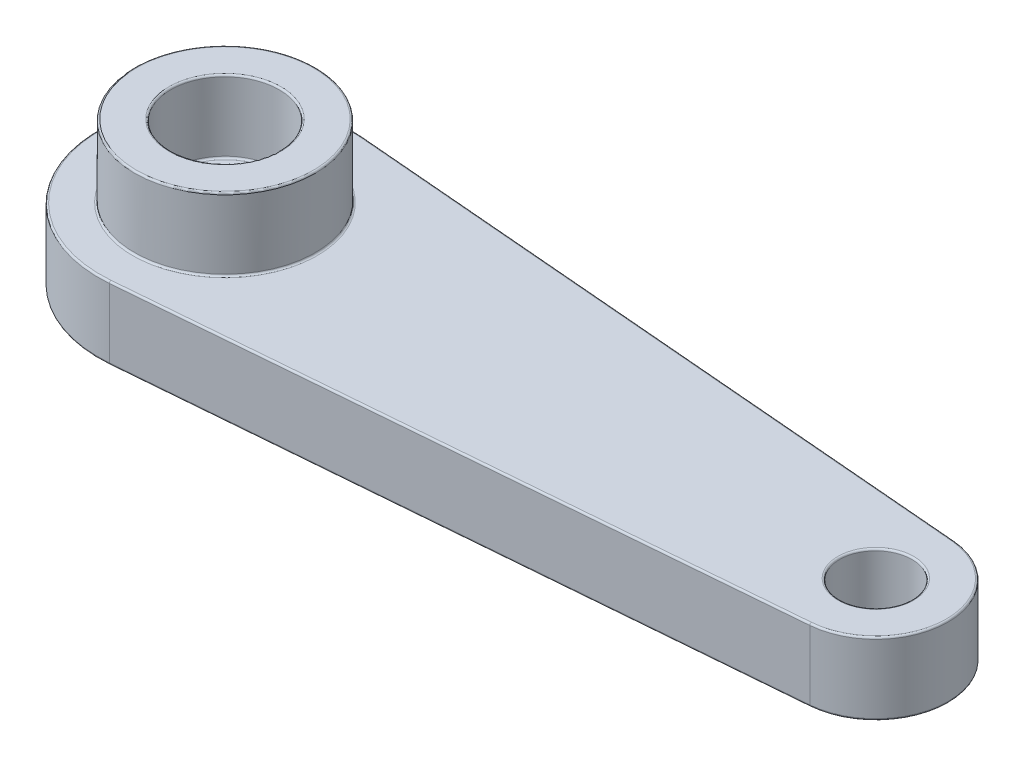
ISO-10303-21;
HEADER;
FILE_DESCRIPTION(('STEP AP214'),'2;1');
FILE_NAME('part.step','',(''),(''),'','','');
FILE_SCHEMA(('AUTOMOTIVE_DESIGN { 1 0 10303 214 1 1 1 1 }'));
ENDSEC;
DATA;
#1=APPLICATION_CONTEXT('core data for automotive mechanical design processes');
#2=APPLICATION_PROTOCOL_DEFINITION('international standard','automotive_design',2000,#1);
#3=PRODUCT_CONTEXT('',#1,'mechanical');
#4=PRODUCT('Part','Part','',(#3));
#5=PRODUCT_RELATED_PRODUCT_CATEGORY('part','',(#4));
#6=PRODUCT_DEFINITION_FORMATION('','',#4);
#7=PRODUCT_DEFINITION_CONTEXT('part definition',#1,'design');
#8=PRODUCT_DEFINITION('design','',#6,#7);
#9=PRODUCT_DEFINITION_SHAPE('','',#8);
#10=(LENGTH_UNIT() NAMED_UNIT(*) SI_UNIT(.MILLI.,.METRE.));
#11=(NAMED_UNIT(*) PLANE_ANGLE_UNIT() SI_UNIT($,.RADIAN.));
#12=(NAMED_UNIT(*) SI_UNIT($,.STERADIAN.) SOLID_ANGLE_UNIT());
#13=UNCERTAINTY_MEASURE_WITH_UNIT(LENGTH_MEASURE(1.E-05),#10,'distance_accuracy_value','');
#14=(GEOMETRIC_REPRESENTATION_CONTEXT(3) GLOBAL_UNCERTAINTY_ASSIGNED_CONTEXT((#13)) GLOBAL_UNIT_ASSIGNED_CONTEXT((#10,
#11,#12)) REPRESENTATION_CONTEXT('',''));
#15=CARTESIAN_POINT('',(0.,0.,0.));
#16=DIRECTION('',(0.,0.,1.));
#17=DIRECTION('',(1.,0.,0.));
#18=AXIS2_PLACEMENT_3D('',#15,#16,#17);
#19=CARTESIAN_POINT('',(0.,-2.,0.));
#20=DIRECTION('',(0.,1.,0.));
#21=DIRECTION('',(0.,0.,1.));
#22=AXIS2_PLACEMENT_3D('',#19,#20,#21);
#23=CYLINDRICAL_SURFACE('',#22,0.5);
#24=CARTESIAN_POINT('',(0.,-1.45,0.));
#25=DIRECTION('',(0.,-1.,0.));
#26=DIRECTION('',(0.,0.,-1.));
#27=AXIS2_PLACEMENT_3D('',#24,#25,#26);
#28=CIRCLE('',#27,0.5);
#29=CARTESIAN_POINT('',(0.,-1.45,-0.5));
#30=VERTEX_POINT('',#29);
#31=EDGE_CURVE('E223',#30,#30,#28,.T.);
#32=ORIENTED_EDGE('',*,*,#31,.T.);
#33=EDGE_LOOP('',(#32));
#34=FACE_BOUND('',#33,.T.);
#35=CARTESIAN_POINT('',(0.,-0.0499999999999999,0.));
#36=DIRECTION('',(0.,-1.,0.));
#37=DIRECTION('',(0.,0.,-1.));
#38=AXIS2_PLACEMENT_3D('',#35,#36,#37);
#39=CIRCLE('',#38,0.5);
#40=CARTESIAN_POINT('',(0.,-0.0499999999999999,-0.5));
#41=VERTEX_POINT('',#40);
#42=EDGE_CURVE('E220',#41,#41,#39,.F.);
#43=ORIENTED_EDGE('',*,*,#42,.T.);
#44=EDGE_LOOP('',(#43));
#45=FACE_BOUND('',#44,.T.);
#46=ADVANCED_FACE('F33',(#34,#45),#23,.F.);
#47=CARTESIAN_POINT('',(0.,2.,0.));
#48=DIRECTION('',(0.,1.,0.));
#49=DIRECTION('',(0.,0.,1.));
#50=AXIS2_PLACEMENT_3D('',#47,#48,#49);
#51=PLANE('',#50);
#52=CARTESIAN_POINT('',(0.,2.,0.));
#53=DIRECTION('',(0.,1.,0.));
#54=DIRECTION('',(0.,0.,1.));
#55=AXIS2_PLACEMENT_3D('',#52,#53,#54);
#56=CIRCLE('',#55,1.55);
#57=CARTESIAN_POINT('',(0.,2.,1.55));
#58=VERTEX_POINT('',#57);
#59=EDGE_CURVE('E11',#58,#58,#56,.F.);
#60=ORIENTED_EDGE('',*,*,#59,.T.);
#61=EDGE_LOOP('',(#60));
#62=FACE_BOUND('',#61,.T.);
#63=CARTESIAN_POINT('',(0.,2.,0.));
#64=DIRECTION('',(0.,1.,0.));
#65=DIRECTION('',(0.,0.,1.));
#66=AXIS2_PLACEMENT_3D('',#63,#64,#65);
#67=CIRCLE('',#66,2.45);
#68=CARTESIAN_POINT('',(0.,2.,2.45));
#69=VERTEX_POINT('',#68);
#70=EDGE_CURVE('E42',#69,#69,#67,.T.);
#71=ORIENTED_EDGE('',*,*,#70,.T.);
#72=EDGE_LOOP('',(#71));
#73=FACE_BOUND('',#72,.T.);
#74=ADVANCED_FACE('F266',(#62,#73),#51,.T.);
#75=CARTESIAN_POINT('',(0.,2.,0.));
#76=DIRECTION('',(0.,-1.,0.));
#77=DIRECTION('',(0.,0.,-1.));
#78=AXIS2_PLACEMENT_3D('',#75,#76,#77);
#79=CYLINDRICAL_SURFACE('',#78,2.5);
#80=CARTESIAN_POINT('',(0.,0.0499999999999999,0.));
#81=DIRECTION('',(0.,-1.,0.));
#82=DIRECTION('',(0.,0.,-1.));
#83=AXIS2_PLACEMENT_3D('',#80,#81,#82);
#84=CIRCLE('',#83,2.5);
#85=CARTESIAN_POINT('',(0.,0.0499999999999999,-2.5));
#86=VERTEX_POINT('',#85);
#87=EDGE_CURVE('E182',#86,#86,#84,.F.);
#88=ORIENTED_EDGE('',*,*,#87,.T.);
#89=EDGE_LOOP('',(#88));
#90=FACE_BOUND('',#89,.T.);
#91=CARTESIAN_POINT('',(0.,1.95,0.));
#92=DIRECTION('',(0.,1.,0.));
#93=DIRECTION('',(0.,0.,1.));
#94=AXIS2_PLACEMENT_3D('',#91,#92,#93);
#95=CIRCLE('',#94,2.5);
#96=CARTESIAN_POINT('',(0.,1.95,2.5));
#97=VERTEX_POINT('',#96);
#98=EDGE_CURVE('E179',#97,#97,#95,.F.);
#99=ORIENTED_EDGE('',*,*,#98,.T.);
#100=EDGE_LOOP('',(#99));
#101=FACE_BOUND('',#100,.T.);
#102=ADVANCED_FACE('F272',(#90,#101),#79,.T.);
#103=CARTESIAN_POINT('',(0.,2.,0.));
#104=DIRECTION('',(0.,-1.,0.));
#105=DIRECTION('',(0.,0.,-1.));
#106=AXIS2_PLACEMENT_3D('',#103,#104,#105);
#107=CYLINDRICAL_SURFACE('',#106,1.5);
#108=CARTESIAN_POINT('',(0.,0.0499999999999999,0.));
#109=DIRECTION('',(0.,-1.,0.));
#110=DIRECTION('',(0.,0.,-1.));
#111=AXIS2_PLACEMENT_3D('',#108,#109,#110);
#112=CIRCLE('',#111,1.5);
#113=CARTESIAN_POINT('',(0.,0.0499999999999999,-1.5));
#114=VERTEX_POINT('',#113);
#115=EDGE_CURVE('E188',#114,#114,#112,.T.);
#116=ORIENTED_EDGE('',*,*,#115,.T.);
#117=EDGE_LOOP('',(#116));
#118=FACE_BOUND('',#117,.T.);
#119=CARTESIAN_POINT('',(0.,1.95,0.));
#120=DIRECTION('',(0.,1.,0.));
#121=DIRECTION('',(0.,0.,1.));
#122=AXIS2_PLACEMENT_3D('',#119,#120,#121);
#123=CIRCLE('',#122,1.5);
#124=CARTESIAN_POINT('',(0.,1.95,1.5));
#125=VERTEX_POINT('',#124);
#126=EDGE_CURVE('E185',#125,#125,#123,.T.);
#127=ORIENTED_EDGE('',*,*,#126,.T.);
#128=EDGE_LOOP('',(#127));
#129=FACE_BOUND('',#128,.T.);
#130=ADVANCED_FACE('F302',(#118,#129),#107,.F.);
#131=CARTESIAN_POINT('',(0.,0.,0.));
#132=DIRECTION('',(0.,-1.,0.));
#133=DIRECTION('',(0.,0.,-1.));
#134=AXIS2_PLACEMENT_3D('',#131,#132,#133);
#135=PLANE('',#134);
#136=CARTESIAN_POINT('',(0.,0.,0.));
#137=DIRECTION('',(0.,-1.,0.));
#138=DIRECTION('',(0.,0.,-1.));
#139=AXIS2_PLACEMENT_3D('',#136,#137,#138);
#140=CIRCLE('',#139,0.55);
#141=CARTESIAN_POINT('',(0.,0.,-0.55));
#142=VERTEX_POINT('',#141);
#143=EDGE_CURVE('E141',#142,#142,#140,.T.);
#144=ORIENTED_EDGE('',*,*,#143,.T.);
#145=EDGE_LOOP('',(#144));
#146=FACE_BOUND('',#145,.T.);
#147=CARTESIAN_POINT('',(0.,0.,0.));
#148=DIRECTION('',(0.,-1.,0.));
#149=DIRECTION('',(0.,0.,-1.));
#150=AXIS2_PLACEMENT_3D('',#147,#148,#149);
#151=CIRCLE('',#150,1.45);
#152=CARTESIAN_POINT('',(0.,0.,-1.45));
#153=VERTEX_POINT('',#152);
#154=EDGE_CURVE('E138',#153,#153,#151,.F.);
#155=ORIENTED_EDGE('',*,*,#154,.T.);
#156=EDGE_LOOP('',(#155));
#157=FACE_BOUND('',#156,.T.);
#158=ADVANCED_FACE('F291',(#146,#157),#135,.F.);
#159=CARTESIAN_POINT('',(0.,-2.,0.));
#160=DIRECTION('',(0.,1.,0.));
#161=DIRECTION('',(0.,0.,1.));
#162=AXIS2_PLACEMENT_3D('',#159,#160,#161);
#163=CYLINDRICAL_SURFACE('',#162,3.5);
#164=DIRECTION('',(0.,1.,0.));
#165=VECTOR('',#164,1.);
#166=CARTESIAN_POINT('',(0.291666666666667,-2.,3.48782605007124));
#167=LINE('',#166,#165);
#168=CARTESIAN_POINT('',(0.291666666666667,-1.95,3.48782605007124));
#169=VERTEX_POINT('',#168);
#170=CARTESIAN_POINT('',(0.291666666666667,-0.0499999999999999,3.48782605007124));
#171=VERTEX_POINT('',#170);
#172=EDGE_CURVE('E203',#169,#171,#167,.T.);
#173=ORIENTED_EDGE('',*,*,#172,.T.);
#174=CARTESIAN_POINT('',(0.,-0.0499999999999999,0.));
#175=DIRECTION('',(0.,-1.,0.));
#176=DIRECTION('',(0.,0.,-1.));
#177=AXIS2_PLACEMENT_3D('',#174,#175,#176);
#178=CIRCLE('',#177,3.5);
#179=CARTESIAN_POINT('',(0.291666666666667,-0.0499999999999999,-3.48782605007124));
#180=VERTEX_POINT('',#179);
#181=EDGE_CURVE('E166',#171,#180,#178,.T.);
#182=ORIENTED_EDGE('',*,*,#181,.T.);
#183=DIRECTION('',(0.,1.,0.));
#184=VECTOR('',#183,1.);
#185=CARTESIAN_POINT('',(0.291666666666667,-2.,-3.48782605007124));
#186=LINE('',#185,#184);
#187=CARTESIAN_POINT('',(0.291666666666667,-1.95,-3.48782605007124));
#188=VERTEX_POINT('',#187);
#189=EDGE_CURVE('E213',#188,#180,#186,.T.);
#190=ORIENTED_EDGE('',*,*,#189,.F.);
#191=CARTESIAN_POINT('',(0.,-1.95,0.));
#192=DIRECTION('',(0.,-1.,0.));
#193=DIRECTION('',(0.,0.,-1.));
#194=AXIS2_PLACEMENT_3D('',#191,#192,#193);
#195=CIRCLE('',#194,3.5);
#196=EDGE_CURVE('E110',#188,#169,#195,.F.);
#197=ORIENTED_EDGE('',*,*,#196,.T.);
#198=EDGE_LOOP('',(#173,#182,#190,#197));
#199=FACE_BOUND('',#198,.T.);
#200=ADVANCED_FACE('F217',(#199),#163,.T.);
#201=CARTESIAN_POINT('',(0.291666666666667,-2.,-3.48782605007124));
#202=DIRECTION('',(0.0833333333333334,0.,-0.996521728591783));
#203=DIRECTION('',(-0.996521728591783,0.,-0.0833333333333334));
#204=AXIS2_PLACEMENT_3D('',#201,#202,#203);
#205=PLANE('',#204);
#206=ORIENTED_EDGE('',*,*,#189,.T.);
#207=DIRECTION('',(-0.996521728591783,0.,-0.0833333333333334));
#208=VECTOR('',#207,1.);
#209=CARTESIAN_POINT('',(18.1666666666667,-0.05,-1.99304345718356));
#210=LINE('',#209,#208);
#211=CARTESIAN_POINT('',(18.1666666666667,-0.0499999999999999,-1.99304345718357));
#212=VERTEX_POINT('',#211);
#213=EDGE_CURVE('E50',#180,#212,#210,.F.);
#214=ORIENTED_EDGE('',*,*,#213,.T.);
#215=DIRECTION('',(0.,1.,0.));
#216=VECTOR('',#215,1.);
#217=CARTESIAN_POINT('',(18.1666666666667,-2.,-1.99304345718357));
#218=LINE('',#217,#216);
#219=CARTESIAN_POINT('',(18.1666666666667,-1.95,-1.99304345718357));
#220=VERTEX_POINT('',#219);
#221=EDGE_CURVE('E214',#220,#212,#218,.T.);
#222=ORIENTED_EDGE('',*,*,#221,.F.);
#223=DIRECTION('',(-0.996521728591783,0.,-0.0833333333333334));
#224=VECTOR('',#223,1.);
#225=CARTESIAN_POINT('',(0.291666666666667,-1.95,-3.48782605007124));
#226=LINE('',#225,#224);
#227=EDGE_CURVE('E176',#220,#188,#226,.T.);
#228=ORIENTED_EDGE('',*,*,#227,.T.);
#229=EDGE_LOOP('',(#206,#214,#222,#228));
#230=FACE_BOUND('',#229,.T.);
#231=ADVANCED_FACE('F212',(#230),#205,.T.);
#232=CARTESIAN_POINT('',(18.,-2.,0.));
#233=DIRECTION('',(0.,1.,0.));
#234=DIRECTION('',(0.,0.,1.));
#235=AXIS2_PLACEMENT_3D('',#232,#233,#234);
#236=CYLINDRICAL_SURFACE('',#235,2.);
#237=ORIENTED_EDGE('',*,*,#221,.T.);
#238=CARTESIAN_POINT('',(18.,-0.0499999999999999,0.));
#239=DIRECTION('',(0.,-1.,0.));
#240=DIRECTION('',(0.,0.,-1.));
#241=AXIS2_PLACEMENT_3D('',#238,#239,#240);
#242=CIRCLE('',#241,2.);
#243=CARTESIAN_POINT('',(18.1666666666667,-0.0499999999999999,1.99304345718357));
#244=VERTEX_POINT('',#243);
#245=EDGE_CURVE('E174',#212,#244,#242,.T.);
#246=ORIENTED_EDGE('',*,*,#245,.T.);
#247=DIRECTION('',(0.,1.,0.));
#248=VECTOR('',#247,1.);
#249=CARTESIAN_POINT('',(18.1666666666667,-2.,1.99304345718357));
#250=LINE('',#249,#248);
#251=CARTESIAN_POINT('',(18.1666666666667,-1.95,1.99304345718357));
#252=VERTEX_POINT('',#251);
#253=EDGE_CURVE('E225',#252,#244,#250,.T.);
#254=ORIENTED_EDGE('',*,*,#253,.F.);
#255=CARTESIAN_POINT('',(18.,-1.95,0.));
#256=DIRECTION('',(0.,-1.,0.));
#257=DIRECTION('',(0.,0.,-1.));
#258=AXIS2_PLACEMENT_3D('',#255,#256,#257);
#259=CIRCLE('',#258,2.);
#260=EDGE_CURVE('E57',#252,#220,#259,.F.);
#261=ORIENTED_EDGE('',*,*,#260,.T.);
#262=EDGE_LOOP('',(#237,#246,#254,#261));
#263=FACE_BOUND('',#262,.T.);
#264=ADVANCED_FACE('F294',(#263),#236,.T.);
#265=CARTESIAN_POINT('',(0.291666666666667,-2.,3.48782605007124));
#266=DIRECTION('',(0.0833333333333334,0.,0.996521728591783));
#267=DIRECTION('',(0.996521728591783,0.,-0.0833333333333334));
#268=AXIS2_PLACEMENT_3D('',#265,#266,#267);
#269=PLANE('',#268);
#270=ORIENTED_EDGE('',*,*,#253,.T.);
#271=DIRECTION('',(0.996521728591783,0.,-0.0833333333333334));
#272=VECTOR('',#271,1.);
#273=CARTESIAN_POINT('',(0.291666666666667,-0.05,3.48782605007124));
#274=LINE('',#273,#272);
#275=EDGE_CURVE('E171',#244,#171,#274,.F.);
#276=ORIENTED_EDGE('',*,*,#275,.T.);
#277=ORIENTED_EDGE('',*,*,#172,.F.);
#278=DIRECTION('',(0.996521728591783,0.,-0.0833333333333334));
#279=VECTOR('',#278,1.);
#280=CARTESIAN_POINT('',(0.291666666666667,-1.95,3.48782605007124));
#281=LINE('',#280,#279);
#282=EDGE_CURVE('E169',#169,#252,#281,.T.);
#283=ORIENTED_EDGE('',*,*,#282,.T.);
#284=EDGE_LOOP('',(#270,#276,#277,#283));
#285=FACE_BOUND('',#284,.T.);
#286=ADVANCED_FACE('F286',(#285),#269,.T.);
#287=CARTESIAN_POINT('',(0.,-2.,0.));
#288=DIRECTION('',(0.,-1.,0.));
#289=DIRECTION('',(0.,0.,-1.));
#290=AXIS2_PLACEMENT_3D('',#287,#288,#289);
#291=PLANE('',#290);
#292=CARTESIAN_POINT('',(0.,-2.,0.));
#293=DIRECTION('',(0.,-1.,0.));
#294=DIRECTION('',(0.,0.,-1.));
#295=AXIS2_PLACEMENT_3D('',#292,#293,#294);
#296=CIRCLE('',#295,2.05);
#297=CARTESIAN_POINT('',(0.,-2.,-2.05));
#298=VERTEX_POINT('',#297);
#299=EDGE_CURVE('E131',#298,#298,#296,.F.);
#300=ORIENTED_EDGE('',*,*,#299,.T.);
#301=EDGE_LOOP('',(#300));
#302=FACE_BOUND('',#301,.T.);
#303=CARTESIAN_POINT('',(18.,-2.,0.));
#304=DIRECTION('',(0.,-1.,0.));
#305=DIRECTION('',(0.,0.,-1.));
#306=AXIS2_PLACEMENT_3D('',#303,#304,#305);
#307=CIRCLE('',#306,1.05);
#308=CARTESIAN_POINT('',(18.,-2.,-1.05));
#309=VERTEX_POINT('',#308);
#310=EDGE_CURVE('E128',#309,#309,#307,.F.);
#311=ORIENTED_EDGE('',*,*,#310,.T.);
#312=EDGE_LOOP('',(#311));
#313=FACE_BOUND('',#312,.T.);
#314=DIRECTION('',(0.996521728591783,0.,-0.0833333333333334));
#315=VECTOR('',#314,1.);
#316=CARTESIAN_POINT('',(0.2875,-2.,3.43799996364165));
#317=LINE('',#316,#315);
#318=CARTESIAN_POINT('',(18.1625,-2.,1.94321737075398));
#319=VERTEX_POINT('',#318);
#320=CARTESIAN_POINT('',(0.2875,-2.,3.43799996364165));
#321=VERTEX_POINT('',#320);
#322=EDGE_CURVE('E127',#319,#321,#317,.F.);
#323=ORIENTED_EDGE('',*,*,#322,.T.);
#324=CARTESIAN_POINT('',(0.,-2.,0.));
#325=DIRECTION('',(0.,-1.,0.));
#326=DIRECTION('',(0.,0.,-1.));
#327=AXIS2_PLACEMENT_3D('',#324,#325,#326);
#328=CIRCLE('',#327,3.45);
#329=CARTESIAN_POINT('',(0.2875,-2.,-3.43799996364165));
#330=VERTEX_POINT('',#329);
#331=EDGE_CURVE('E107',#321,#330,#328,.T.);
#332=ORIENTED_EDGE('',*,*,#331,.T.);
#333=DIRECTION('',(-0.996521728591783,0.,-0.0833333333333334));
#334=VECTOR('',#333,1.);
#335=CARTESIAN_POINT('',(0.2875,-2.,-3.43799996364165));
#336=LINE('',#335,#334);
#337=CARTESIAN_POINT('',(18.1625,-2.,-1.94321737075398));
#338=VERTEX_POINT('',#337);
#339=EDGE_CURVE('E117',#330,#338,#336,.F.);
#340=ORIENTED_EDGE('',*,*,#339,.T.);
#341=CARTESIAN_POINT('',(18.,-2.,0.));
#342=DIRECTION('',(0.,-1.,0.));
#343=DIRECTION('',(0.,0.,-1.));
#344=AXIS2_PLACEMENT_3D('',#341,#342,#343);
#345=CIRCLE('',#344,1.95);
#346=EDGE_CURVE('E122',#338,#319,#345,.T.);
#347=ORIENTED_EDGE('',*,*,#346,.T.);
#348=EDGE_LOOP('',(#323,#332,#340,#347));
#349=FACE_BOUND('',#348,.T.);
#350=ADVANCED_FACE('F125',(#302,#313,#349),#291,.T.);
#351=CARTESIAN_POINT('',(18.,0.,0.));
#352=DIRECTION('',(0.,-1.,0.));
#353=DIRECTION('',(0.,0.,-1.));
#354=AXIS2_PLACEMENT_3D('',#351,#352,#353);
#355=CIRCLE('',#354,1.05);
#356=CARTESIAN_POINT('',(18.,0.,-1.05));
#357=VERTEX_POINT('',#356);
#358=EDGE_CURVE('E162',#357,#357,#355,.T.);
#359=ORIENTED_EDGE('',*,*,#358,.T.);
#360=EDGE_LOOP('',(#359));
#361=FACE_BOUND('',#360,.T.);
#362=DIRECTION('',(-0.996521728591783,0.,-0.0833333333333334));
#363=VECTOR('',#362,1.);
#364=CARTESIAN_POINT('',(0.2875,0.,-3.43799996364165));
#365=LINE('',#364,#363);
#366=CARTESIAN_POINT('',(18.1625,0.,-1.94321737075398));
#367=VERTEX_POINT('',#366);
#368=CARTESIAN_POINT('',(0.2875,0.,-3.43799996364165));
#369=VERTEX_POINT('',#368);
#370=EDGE_CURVE('E153',#367,#369,#365,.T.);
#371=ORIENTED_EDGE('',*,*,#370,.T.);
#372=CARTESIAN_POINT('',(0.,0.,0.));
#373=DIRECTION('',(0.,-1.,0.));
#374=DIRECTION('',(0.,0.,-1.));
#375=AXIS2_PLACEMENT_3D('',#372,#373,#374);
#376=CIRCLE('',#375,3.45);
#377=CARTESIAN_POINT('',(0.2875,0.,3.43799996364165));
#378=VERTEX_POINT('',#377);
#379=EDGE_CURVE('E159',#369,#378,#376,.F.);
#380=ORIENTED_EDGE('',*,*,#379,.T.);
#381=DIRECTION('',(0.996521728591783,0.,-0.0833333333333334));
#382=VECTOR('',#381,1.);
#383=CARTESIAN_POINT('',(18.1625,0.,1.94321737075398));
#384=LINE('',#383,#382);
#385=CARTESIAN_POINT('',(18.1625,0.,1.94321737075398));
#386=VERTEX_POINT('',#385);
#387=EDGE_CURVE('E157',#378,#386,#384,.T.);
#388=ORIENTED_EDGE('',*,*,#387,.T.);
#389=CARTESIAN_POINT('',(18.,0.,0.));
#390=DIRECTION('',(0.,-1.,0.));
#391=DIRECTION('',(0.,0.,-1.));
#392=AXIS2_PLACEMENT_3D('',#389,#390,#391);
#393=CIRCLE('',#392,1.95);
#394=EDGE_CURVE('E155',#386,#367,#393,.F.);
#395=ORIENTED_EDGE('',*,*,#394,.T.);
#396=EDGE_LOOP('',(#371,#380,#388,#395));
#397=FACE_BOUND('',#396,.T.);
#398=CARTESIAN_POINT('',(0.,0.,0.));
#399=DIRECTION('',(0.,-1.,0.));
#400=DIRECTION('',(0.,0.,-1.));
#401=AXIS2_PLACEMENT_3D('',#398,#399,#400);
#402=CIRCLE('',#401,2.55);
#403=CARTESIAN_POINT('',(0.,0.,-2.55));
#404=VERTEX_POINT('',#403);
#405=EDGE_CURVE('E150',#404,#404,#402,.T.);
#406=ORIENTED_EDGE('',*,*,#405,.T.);
#407=EDGE_LOOP('',(#406));
#408=FACE_BOUND('',#407,.T.);
#409=ADVANCED_FACE('F282',(#361,#397,#408),#135,.F.);
#410=CARTESIAN_POINT('',(18.,-2.,0.));
#411=DIRECTION('',(0.,1.,0.));
#412=DIRECTION('',(0.,0.,1.));
#413=AXIS2_PLACEMENT_3D('',#410,#411,#412);
#414=CYLINDRICAL_SURFACE('',#413,1.);
#415=CARTESIAN_POINT('',(18.,-0.0499999999999999,0.));
#416=DIRECTION('',(0.,-1.,0.));
#417=DIRECTION('',(0.,0.,-1.));
#418=AXIS2_PLACEMENT_3D('',#415,#416,#417);
#419=CIRCLE('',#418,1.);
#420=CARTESIAN_POINT('',(18.,-0.0499999999999999,-1.));
#421=VERTEX_POINT('',#420);
#422=EDGE_CURVE('E147',#421,#421,#419,.F.);
#423=ORIENTED_EDGE('',*,*,#422,.T.);
#424=EDGE_LOOP('',(#423));
#425=FACE_BOUND('',#424,.T.);
#426=CARTESIAN_POINT('',(18.,-1.95,0.));
#427=DIRECTION('',(0.,-1.,0.));
#428=DIRECTION('',(0.,0.,-1.));
#429=AXIS2_PLACEMENT_3D('',#426,#427,#428);
#430=CIRCLE('',#429,1.);
#431=CARTESIAN_POINT('',(18.,-1.95,-1.));
#432=VERTEX_POINT('',#431);
#433=EDGE_CURVE('E144',#432,#432,#430,.T.);
#434=ORIENTED_EDGE('',*,*,#433,.T.);
#435=EDGE_LOOP('',(#434));
#436=FACE_BOUND('',#435,.T.);
#437=ADVANCED_FACE('F279',(#425,#436),#414,.F.);
#438=CARTESIAN_POINT('',(0.,-1.5,0.));
#439=DIRECTION('',(0.,-1.,0.));
#440=DIRECTION('',(0.,0.,-1.));
#441=AXIS2_PLACEMENT_3D('',#438,#439,#440);
#442=CYLINDRICAL_SURFACE('',#441,2.);
#443=CARTESIAN_POINT('',(0.,-1.95,0.));
#444=DIRECTION('',(0.,-1.,0.));
#445=DIRECTION('',(0.,0.,-1.));
#446=AXIS2_PLACEMENT_3D('',#443,#444,#445);
#447=CIRCLE('',#446,2.);
#448=CARTESIAN_POINT('',(0.,-1.95,-2.));
#449=VERTEX_POINT('',#448);
#450=EDGE_CURVE('E123',#449,#449,#447,.T.);
#451=ORIENTED_EDGE('',*,*,#450,.T.);
#452=EDGE_LOOP('',(#451));
#453=FACE_BOUND('',#452,.T.);
#454=CARTESIAN_POINT('',(0.,-1.55,0.));
#455=DIRECTION('',(0.,-1.,0.));
#456=DIRECTION('',(0.,0.,-1.));
#457=AXIS2_PLACEMENT_3D('',#454,#455,#456);
#458=CIRCLE('',#457,2.);
#459=CARTESIAN_POINT('',(0.,-1.55,-2.));
#460=VERTEX_POINT('',#459);
#461=EDGE_CURVE('E239',#460,#460,#458,.F.);
#462=ORIENTED_EDGE('',*,*,#461,.T.);
#463=EDGE_LOOP('',(#462));
#464=FACE_BOUND('',#463,.T.);
#465=ADVANCED_FACE('F245',(#453,#464),#442,.F.);
#466=CARTESIAN_POINT('',(0.,-1.5,0.));
#467=DIRECTION('',(0.,-1.,0.));
#468=DIRECTION('',(0.,0.,-1.));
#469=AXIS2_PLACEMENT_3D('',#466,#467,#468);
#470=PLANE('',#469);
#471=CARTESIAN_POINT('',(0.,-1.5,0.));
#472=DIRECTION('',(0.,-1.,0.));
#473=DIRECTION('',(0.,0.,-1.));
#474=AXIS2_PLACEMENT_3D('',#471,#472,#473);
#475=CIRCLE('',#474,0.55);
#476=CARTESIAN_POINT('',(0.,-1.5,-0.55));
#477=VERTEX_POINT('',#476);
#478=EDGE_CURVE('E236',#477,#477,#475,.F.);
#479=ORIENTED_EDGE('',*,*,#478,.T.);
#480=EDGE_LOOP('',(#479));
#481=FACE_BOUND('',#480,.T.);
#482=CARTESIAN_POINT('',(0.,-1.5,0.));
#483=DIRECTION('',(0.,-1.,0.));
#484=DIRECTION('',(0.,0.,-1.));
#485=AXIS2_PLACEMENT_3D('',#482,#483,#484);
#486=CIRCLE('',#485,1.95);
#487=CARTESIAN_POINT('',(0.,-1.5,-1.95));
#488=VERTEX_POINT('',#487);
#489=EDGE_CURVE('E233',#488,#488,#486,.T.);
#490=ORIENTED_EDGE('',*,*,#489,.T.);
#491=EDGE_LOOP('',(#490));
#492=FACE_BOUND('',#491,.T.);
#493=ADVANCED_FACE('F261',(#481,#492),#470,.T.);
#494=CARTESIAN_POINT('',(0.,-1.45,0.));
#495=DIRECTION('',(0.,-1.,0.));
#496=DIRECTION('',(0.,0.,-1.));
#497=AXIS2_PLACEMENT_3D('',#494,#495,#496);
#498=TOROIDAL_SURFACE('',#497,0.55,0.05);
#499=ORIENTED_EDGE('',*,*,#478,.F.);
#500=EDGE_LOOP('',(#499));
#501=FACE_BOUND('',#500,.T.);
#502=ORIENTED_EDGE('',*,*,#31,.F.);
#503=EDGE_LOOP('',(#502));
#504=FACE_BOUND('',#503,.T.);
#505=ADVANCED_FACE('F251',(#501,#504),#498,.T.);
#506=CARTESIAN_POINT('',(0.,-1.95,0.));
#507=DIRECTION('',(0.,-1.,0.));
#508=DIRECTION('',(0.,0.,-1.));
#509=AXIS2_PLACEMENT_3D('',#506,#507,#508);
#510=TOROIDAL_SURFACE('',#509,2.05,0.05);
#511=ORIENTED_EDGE('',*,*,#299,.F.);
#512=EDGE_LOOP('',(#511));
#513=FACE_BOUND('',#512,.T.);
#514=ORIENTED_EDGE('',*,*,#450,.F.);
#515=EDGE_LOOP('',(#514));
#516=FACE_BOUND('',#515,.T.);
#517=ADVANCED_FACE('F248',(#513,#516),#510,.T.);
#518=CARTESIAN_POINT('',(0.,-1.55,0.));
#519=DIRECTION('',(0.,-1.,0.));
#520=DIRECTION('',(0.,0.,-1.));
#521=AXIS2_PLACEMENT_3D('',#518,#519,#520);
#522=TOROIDAL_SURFACE('',#521,1.95,0.05);
#523=ORIENTED_EDGE('',*,*,#461,.F.);
#524=EDGE_LOOP('',(#523));
#525=FACE_BOUND('',#524,.T.);
#526=ORIENTED_EDGE('',*,*,#489,.F.);
#527=EDGE_LOOP('',(#526));
#528=FACE_BOUND('',#527,.T.);
#529=ADVANCED_FACE('F250',(#525,#528),#522,.F.);
#530=CARTESIAN_POINT('',(0.,-0.0499999999999999,0.));
#531=DIRECTION('',(0.,-1.,0.));
#532=DIRECTION('',(0.,0.,-1.));
#533=AXIS2_PLACEMENT_3D('',#530,#531,#532);
#534=TOROIDAL_SURFACE('',#533,0.55,0.05);
#535=ORIENTED_EDGE('',*,*,#143,.F.);
#536=EDGE_LOOP('',(#535));
#537=FACE_BOUND('',#536,.T.);
#538=ORIENTED_EDGE('',*,*,#42,.F.);
#539=EDGE_LOOP('',(#538));
#540=FACE_BOUND('',#539,.T.);
#541=ADVANCED_FACE('F258',(#537,#540),#534,.T.);
#542=CARTESIAN_POINT('',(18.,-0.0499999999999999,0.));
#543=DIRECTION('',(0.,-1.,0.));
#544=DIRECTION('',(0.,0.,-1.));
#545=AXIS2_PLACEMENT_3D('',#542,#543,#544);
#546=TOROIDAL_SURFACE('',#545,1.05,0.05);
#547=ORIENTED_EDGE('',*,*,#358,.F.);
#548=EDGE_LOOP('',(#547));
#549=FACE_BOUND('',#548,.T.);
#550=ORIENTED_EDGE('',*,*,#422,.F.);
#551=EDGE_LOOP('',(#550));
#552=FACE_BOUND('',#551,.T.);
#553=ADVANCED_FACE('F363',(#549,#552),#546,.T.);
#554=CARTESIAN_POINT('',(18.,-1.95,0.));
#555=DIRECTION('',(0.,-1.,0.));
#556=DIRECTION('',(0.,0.,-1.));
#557=AXIS2_PLACEMENT_3D('',#554,#555,#556);
#558=TOROIDAL_SURFACE('',#557,1.05,0.05);
#559=ORIENTED_EDGE('',*,*,#433,.F.);
#560=EDGE_LOOP('',(#559));
#561=FACE_BOUND('',#560,.T.);
#562=ORIENTED_EDGE('',*,*,#310,.F.);
#563=EDGE_LOOP('',(#562));
#564=FACE_BOUND('',#563,.T.);
#565=ADVANCED_FACE('F349',(#561,#564),#558,.T.);
#566=CARTESIAN_POINT('',(18.,-0.0499999999999999,0.));
#567=DIRECTION('',(0.,-1.,0.));
#568=DIRECTION('',(0.,0.,-1.));
#569=AXIS2_PLACEMENT_3D('',#566,#567,#568);
#570=TOROIDAL_SURFACE('',#569,1.95,0.05);
#571=CARTESIAN_POINT('',(18.1625,-0.0499999999999999,1.94321737075398));
#572=DIRECTION('',(-0.996521728591784,0.,0.0833333333333242));
#573=DIRECTION('',(0.0833333333333242,0.,0.996521728591784));
#574=AXIS2_PLACEMENT_3D('',#571,#572,#573);
#575=CIRCLE('',#574,0.05);
#576=EDGE_CURVE('E197',#244,#386,#575,.T.);
#577=ORIENTED_EDGE('',*,*,#576,.F.);
#578=ORIENTED_EDGE('',*,*,#245,.F.);
#579=CARTESIAN_POINT('',(18.1625,-0.05,-1.94321737075398));
#580=DIRECTION('',(-0.996521728591784,0.,-0.0833333333333242));
#581=DIRECTION('',(-0.0833333333333242,0.,0.996521728591784));
#582=AXIS2_PLACEMENT_3D('',#579,#580,#581);
#583=CIRCLE('',#582,0.05);
#584=EDGE_CURVE('E200',#367,#212,#583,.T.);
#585=ORIENTED_EDGE('',*,*,#584,.F.);
#586=ORIENTED_EDGE('',*,*,#394,.F.);
#587=EDGE_LOOP('',(#577,#578,#585,#586));
#588=FACE_BOUND('',#587,.T.);
#589=ADVANCED_FACE('F345',(#588),#570,.T.);
#590=CARTESIAN_POINT('',(0.2875,-0.05,-3.43799996364165));
#591=DIRECTION('',(0.996521728591783,0.,0.0833333333333334));
#592=DIRECTION('',(0.0833333333333334,0.,-0.996521728591783));
#593=AXIS2_PLACEMENT_3D('',#590,#591,#592);
#594=CYLINDRICAL_SURFACE('',#593,0.05);
#595=ORIENTED_EDGE('',*,*,#584,.T.);
#596=ORIENTED_EDGE('',*,*,#213,.F.);
#597=CARTESIAN_POINT('',(0.2875,-0.05,-3.43799996364165));
#598=DIRECTION('',(-0.996521728591783,0.,-0.0833333333333339));
#599=DIRECTION('',(-0.0833333333333339,0.,0.996521728591783));
#600=AXIS2_PLACEMENT_3D('',#597,#598,#599);
#601=CIRCLE('',#600,0.05);
#602=EDGE_CURVE('E195',#369,#180,#601,.T.);
#603=ORIENTED_EDGE('',*,*,#602,.F.);
#604=ORIENTED_EDGE('',*,*,#370,.F.);
#605=EDGE_LOOP('',(#595,#596,#603,#604));
#606=FACE_BOUND('',#605,.T.);
#607=ADVANCED_FACE('F348',(#606),#594,.T.);
#608=CARTESIAN_POINT('',(0.2875,-0.05,3.43799996364165));
#609=DIRECTION('',(-0.996521728591783,0.,0.0833333333333334));
#610=DIRECTION('',(0.0833333333333334,0.,0.996521728591783));
#611=AXIS2_PLACEMENT_3D('',#608,#609,#610);
#612=CYLINDRICAL_SURFACE('',#611,0.05);
#613=ORIENTED_EDGE('',*,*,#576,.T.);
#614=ORIENTED_EDGE('',*,*,#387,.F.);
#615=CARTESIAN_POINT('',(0.2875,-0.05,3.43799996364165));
#616=DIRECTION('',(-0.996521728591783,0.,0.0833333333333332));
#617=DIRECTION('',(0.0833333333333332,0.,0.996521728591783));
#618=AXIS2_PLACEMENT_3D('',#615,#616,#617);
#619=CIRCLE('',#618,0.05);
#620=EDGE_CURVE('E193',#171,#378,#619,.T.);
#621=ORIENTED_EDGE('',*,*,#620,.F.);
#622=ORIENTED_EDGE('',*,*,#275,.F.);
#623=EDGE_LOOP('',(#613,#614,#621,#622));
#624=FACE_BOUND('',#623,.T.);
#625=ADVANCED_FACE('F353',(#624),#612,.T.);
#626=CARTESIAN_POINT('',(0.,-0.0499999999999999,0.));
#627=DIRECTION('',(0.,-1.,0.));
#628=DIRECTION('',(0.,0.,-1.));
#629=AXIS2_PLACEMENT_3D('',#626,#627,#628);
#630=TOROIDAL_SURFACE('',#629,3.45,0.05);
#631=ORIENTED_EDGE('',*,*,#602,.T.);
#632=ORIENTED_EDGE('',*,*,#181,.F.);
#633=ORIENTED_EDGE('',*,*,#620,.T.);
#634=ORIENTED_EDGE('',*,*,#379,.F.);
#635=EDGE_LOOP('',(#631,#632,#633,#634));
#636=FACE_BOUND('',#635,.T.);
#637=ADVANCED_FACE('F338',(#636),#630,.T.);
#638=CARTESIAN_POINT('',(18.,-1.95,0.));
#639=DIRECTION('',(0.,-1.,0.));
#640=DIRECTION('',(0.,0.,-1.));
#641=AXIS2_PLACEMENT_3D('',#638,#639,#640);
#642=TOROIDAL_SURFACE('',#641,1.95,0.05);
#643=CARTESIAN_POINT('',(18.1625,-1.95,1.94321737075398));
#644=DIRECTION('',(-0.996521728591784,0.,0.0833333333333242));
#645=DIRECTION('',(0.0833333333333242,0.,0.996521728591784));
#646=AXIS2_PLACEMENT_3D('',#643,#644,#645);
#647=CIRCLE('',#646,0.05);
#648=EDGE_CURVE('E113',#319,#252,#647,.T.);
#649=ORIENTED_EDGE('',*,*,#648,.F.);
#650=ORIENTED_EDGE('',*,*,#346,.F.);
#651=CARTESIAN_POINT('',(18.1625,-1.95,-1.94321737075398));
#652=DIRECTION('',(-0.996521728591784,0.,-0.0833333333333242));
#653=DIRECTION('',(-0.0833333333333242,0.,0.996521728591784));
#654=AXIS2_PLACEMENT_3D('',#651,#652,#653);
#655=CIRCLE('',#654,0.05);
#656=EDGE_CURVE('E37',#220,#338,#655,.T.);
#657=ORIENTED_EDGE('',*,*,#656,.F.);
#658=ORIENTED_EDGE('',*,*,#260,.F.);
#659=EDGE_LOOP('',(#649,#650,#657,#658));
#660=FACE_BOUND('',#659,.T.);
#661=ADVANCED_FACE('F210',(#660),#642,.T.);
#662=CARTESIAN_POINT('',(0.2875,-1.95,-3.43799996364165));
#663=DIRECTION('',(-0.996521728591783,0.,-0.0833333333333334));
#664=DIRECTION('',(-0.0833333333333334,0.,0.996521728591783));
#665=AXIS2_PLACEMENT_3D('',#662,#663,#664);
#666=CYLINDRICAL_SURFACE('',#665,0.05);
#667=ORIENTED_EDGE('',*,*,#656,.T.);
#668=ORIENTED_EDGE('',*,*,#339,.F.);
#669=CARTESIAN_POINT('',(0.2875,-1.95,-3.43799996364165));
#670=DIRECTION('',(-0.996521728591783,0.,-0.0833333333333342));
#671=DIRECTION('',(-0.0833333333333342,0.,0.996521728591783));
#672=AXIS2_PLACEMENT_3D('',#669,#670,#671);
#673=CIRCLE('',#672,0.05);
#674=EDGE_CURVE('E103',#188,#330,#673,.T.);
#675=ORIENTED_EDGE('',*,*,#674,.F.);
#676=ORIENTED_EDGE('',*,*,#227,.F.);
#677=EDGE_LOOP('',(#667,#668,#675,#676));
#678=FACE_BOUND('',#677,.T.);
#679=ADVANCED_FACE('F118',(#678),#666,.T.);
#680=CARTESIAN_POINT('',(0.2875,-1.95,3.43799996364165));
#681=DIRECTION('',(0.996521728591783,0.,-0.0833333333333334));
#682=DIRECTION('',(-0.0833333333333334,0.,-0.996521728591783));
#683=AXIS2_PLACEMENT_3D('',#680,#681,#682);
#684=CYLINDRICAL_SURFACE('',#683,0.05);
#685=ORIENTED_EDGE('',*,*,#648,.T.);
#686=ORIENTED_EDGE('',*,*,#282,.F.);
#687=CARTESIAN_POINT('',(0.2875,-1.95,3.43799996364165));
#688=DIRECTION('',(-0.996521728591783,0.,0.0833333333333342));
#689=DIRECTION('',(0.0833333333333342,0.,0.996521728591783));
#690=AXIS2_PLACEMENT_3D('',#687,#688,#689);
#691=CIRCLE('',#690,0.05);
#692=EDGE_CURVE('E114',#321,#169,#691,.T.);
#693=ORIENTED_EDGE('',*,*,#692,.F.);
#694=ORIENTED_EDGE('',*,*,#322,.F.);
#695=EDGE_LOOP('',(#685,#686,#693,#694));
#696=FACE_BOUND('',#695,.T.);
#697=ADVANCED_FACE('F208',(#696),#684,.T.);
#698=CARTESIAN_POINT('',(0.,-1.95,0.));
#699=DIRECTION('',(0.,-1.,0.));
#700=DIRECTION('',(0.,0.,-1.));
#701=AXIS2_PLACEMENT_3D('',#698,#699,#700);
#702=TOROIDAL_SURFACE('',#701,3.45,0.05);
#703=ORIENTED_EDGE('',*,*,#674,.T.);
#704=ORIENTED_EDGE('',*,*,#331,.F.);
#705=ORIENTED_EDGE('',*,*,#692,.T.);
#706=ORIENTED_EDGE('',*,*,#196,.F.);
#707=EDGE_LOOP('',(#703,#704,#705,#706));
#708=FACE_BOUND('',#707,.T.);
#709=ADVANCED_FACE('F105',(#708),#702,.T.);
#710=CARTESIAN_POINT('',(0.,0.0499999999999999,0.));
#711=DIRECTION('',(0.,-1.,0.));
#712=DIRECTION('',(0.,0.,-1.));
#713=AXIS2_PLACEMENT_3D('',#710,#711,#712);
#714=TOROIDAL_SURFACE('',#713,2.55,0.05);
#715=ORIENTED_EDGE('',*,*,#405,.F.);
#716=EDGE_LOOP('',(#715));
#717=FACE_BOUND('',#716,.T.);
#718=ORIENTED_EDGE('',*,*,#87,.F.);
#719=EDGE_LOOP('',(#718));
#720=FACE_BOUND('',#719,.T.);
#721=ADVANCED_FACE('F327',(#717,#720),#714,.F.);
#722=CARTESIAN_POINT('',(0.,0.0499999999999999,0.));
#723=DIRECTION('',(0.,-1.,0.));
#724=DIRECTION('',(0.,0.,-1.));
#725=AXIS2_PLACEMENT_3D('',#722,#723,#724);
#726=TOROIDAL_SURFACE('',#725,1.45,0.05);
#727=ORIENTED_EDGE('',*,*,#115,.F.);
#728=EDGE_LOOP('',(#727));
#729=FACE_BOUND('',#728,.T.);
#730=ORIENTED_EDGE('',*,*,#154,.F.);
#731=EDGE_LOOP('',(#730));
#732=FACE_BOUND('',#731,.T.);
#733=ADVANCED_FACE('F322',(#729,#732),#726,.F.);
#734=CARTESIAN_POINT('',(0.,1.95,0.));
#735=DIRECTION('',(0.,1.,0.));
#736=DIRECTION('',(0.,0.,1.));
#737=AXIS2_PLACEMENT_3D('',#734,#735,#736);
#738=TOROIDAL_SURFACE('',#737,1.55,0.05);
#739=ORIENTED_EDGE('',*,*,#59,.F.);
#740=EDGE_LOOP('',(#739));
#741=FACE_BOUND('',#740,.T.);
#742=ORIENTED_EDGE('',*,*,#126,.F.);
#743=EDGE_LOOP('',(#742));
#744=FACE_BOUND('',#743,.T.);
#745=ADVANCED_FACE('F316',(#741,#744),#738,.T.);
#746=CARTESIAN_POINT('',(0.,1.95,0.));
#747=DIRECTION('',(0.,1.,0.));
#748=DIRECTION('',(0.,0.,1.));
#749=AXIS2_PLACEMENT_3D('',#746,#747,#748);
#750=TOROIDAL_SURFACE('',#749,2.45,0.05);
#751=ORIENTED_EDGE('',*,*,#98,.F.);
#752=EDGE_LOOP('',(#751));
#753=FACE_BOUND('',#752,.T.);
#754=ORIENTED_EDGE('',*,*,#70,.F.);
#755=EDGE_LOOP('',(#754));
#756=FACE_BOUND('',#755,.T.);
#757=ADVANCED_FACE('F35',(#753,#756),#750,.T.);
#758=CLOSED_SHELL('',(#46,#74,#102,#130,#158,#200,#231,#264,#286,#350,#409,#437,#465,#493,#505,
#517,#529,#541,#553,#565,#589,#607,#625,#637,#661,#679,#697,#709,#721,#733,#745,#757));
#759=MANIFOLD_SOLID_BREP('B2',#758);
#760=ADVANCED_BREP_SHAPE_REPRESENTATION('',(#18,#759),#14);
#761=SHAPE_DEFINITION_REPRESENTATION(#9,#760);
ENDSEC;
END-ISO-10303-21;
